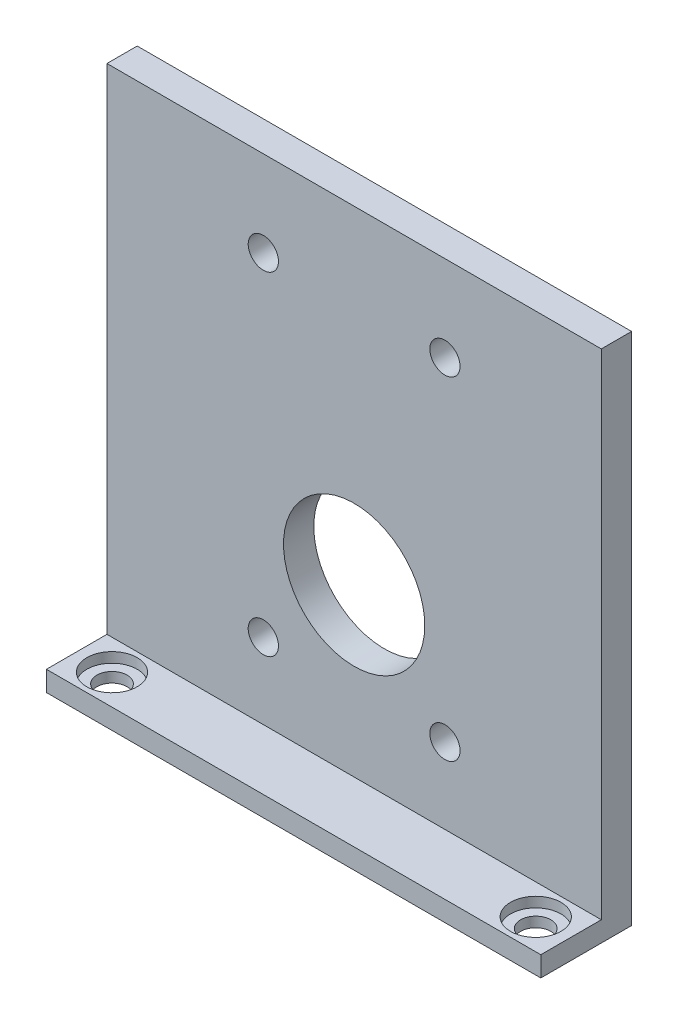
ISO-10303-21;
HEADER;
FILE_DESCRIPTION(('STEP AP214'),'2;1');
FILE_NAME('part.step','',(''),(''),'','','');
FILE_SCHEMA(('AUTOMOTIVE_DESIGN { 1 0 10303 214 1 1 1 1 }'));
ENDSEC;
DATA;
#1=APPLICATION_CONTEXT('core data for automotive mechanical design processes');
#2=APPLICATION_PROTOCOL_DEFINITION('international standard','automotive_design',2000,#1);
#3=PRODUCT_CONTEXT('',#1,'mechanical');
#4=PRODUCT('Part','Part','',(#3));
#5=PRODUCT_RELATED_PRODUCT_CATEGORY('part','',(#4));
#6=PRODUCT_DEFINITION_FORMATION('','',#4);
#7=PRODUCT_DEFINITION_CONTEXT('part definition',#1,'design');
#8=PRODUCT_DEFINITION('design','',#6,#7);
#9=PRODUCT_DEFINITION_SHAPE('','',#8);
#10=(LENGTH_UNIT() NAMED_UNIT(*) SI_UNIT(.MILLI.,.METRE.));
#11=(NAMED_UNIT(*) PLANE_ANGLE_UNIT() SI_UNIT($,.RADIAN.));
#12=(NAMED_UNIT(*) SI_UNIT($,.STERADIAN.) SOLID_ANGLE_UNIT());
#13=UNCERTAINTY_MEASURE_WITH_UNIT(LENGTH_MEASURE(1.E-05),#10,'distance_accuracy_value','');
#14=(GEOMETRIC_REPRESENTATION_CONTEXT(3) GLOBAL_UNCERTAINTY_ASSIGNED_CONTEXT((#13)) GLOBAL_UNIT_ASSIGNED_CONTEXT((#10,
#11,#12)) REPRESENTATION_CONTEXT('',''));
#15=CARTESIAN_POINT('',(0.,0.,0.));
#16=DIRECTION('',(0.,0.,1.));
#17=DIRECTION('',(1.,0.,0.));
#18=AXIS2_PLACEMENT_3D('',#15,#16,#17);
#19=CARTESIAN_POINT('',(24.5,2.,-4.5));
#20=DIRECTION('',(-1.,0.,0.));
#21=DIRECTION('',(0.,0.,1.));
#22=AXIS2_PLACEMENT_3D('',#19,#20,#21);
#23=PLANE('',#22);
#24=DIRECTION('',(0.,0.,-1.));
#25=VECTOR('',#24,1.);
#26=CARTESIAN_POINT('',(24.5,0.,-4.5));
#27=LINE('',#26,#25);
#28=CARTESIAN_POINT('',(24.5,0.,4.5));
#29=VERTEX_POINT('',#28);
#30=CARTESIAN_POINT('',(24.5,0.,-4.5));
#31=VERTEX_POINT('',#30);
#32=EDGE_CURVE('E90',#29,#31,#27,.T.);
#33=ORIENTED_EDGE('',*,*,#32,.T.);
#34=DIRECTION('',(0.,-1.,0.));
#35=VECTOR('',#34,1.);
#36=CARTESIAN_POINT('',(24.5,2.,-4.5));
#37=LINE('',#36,#35);
#38=CARTESIAN_POINT('',(24.5,51.,-4.5));
#39=VERTEX_POINT('',#38);
#40=EDGE_CURVE('E11',#39,#31,#37,.T.);
#41=ORIENTED_EDGE('',*,*,#40,.F.);
#42=DIRECTION('',(0.,0.,-1.));
#43=VECTOR('',#42,1.);
#44=CARTESIAN_POINT('',(24.5,51.,-4.5));
#45=LINE('',#44,#43);
#46=CARTESIAN_POINT('',(24.5,51.,-1.5));
#47=VERTEX_POINT('',#46);
#48=EDGE_CURVE('E164',#47,#39,#45,.T.);
#49=ORIENTED_EDGE('',*,*,#48,.F.);
#50=DIRECTION('',(0.,-1.,0.));
#51=VECTOR('',#50,1.);
#52=CARTESIAN_POINT('',(24.5,51.,-1.5));
#53=LINE('',#52,#51);
#54=CARTESIAN_POINT('',(24.5,2.,-1.5));
#55=VERTEX_POINT('',#54);
#56=EDGE_CURVE('E95',#47,#55,#53,.T.);
#57=ORIENTED_EDGE('',*,*,#56,.T.);
#58=DIRECTION('',(0.,0.,-1.));
#59=VECTOR('',#58,1.);
#60=CARTESIAN_POINT('',(24.5,2.,-4.5));
#61=LINE('',#60,#59);
#62=CARTESIAN_POINT('',(24.5,2.,4.5));
#63=VERTEX_POINT('',#62);
#64=EDGE_CURVE('E84',#63,#55,#61,.T.);
#65=ORIENTED_EDGE('',*,*,#64,.F.);
#66=DIRECTION('',(0.,-1.,0.));
#67=VECTOR('',#66,1.);
#68=CARTESIAN_POINT('',(24.5,2.,4.5));
#69=LINE('',#68,#67);
#70=EDGE_CURVE('E77',#63,#29,#69,.T.);
#71=ORIENTED_EDGE('',*,*,#70,.T.);
#72=EDGE_LOOP('',(#33,#41,#49,#57,#65,#71));
#73=FACE_BOUND('',#72,.T.);
#74=ADVANCED_FACE('F33',(#73),#23,.F.);
#75=CARTESIAN_POINT('',(-24.5,2.,-4.5));
#76=DIRECTION('',(0.,0.,1.));
#77=DIRECTION('',(1.,0.,0.));
#78=AXIS2_PLACEMENT_3D('',#75,#76,#77);
#79=PLANE('',#78);
#80=CARTESIAN_POINT('',(9.,9.5,-4.5));
#81=DIRECTION('',(0.,0.,1.));
#82=DIRECTION('',(1.,0.,0.));
#83=AXIS2_PLACEMENT_3D('',#80,#81,#82);
#84=CIRCLE('',#83,1.5);
#85=CARTESIAN_POINT('',(10.5,9.5,-4.5));
#86=VERTEX_POINT('',#85);
#87=EDGE_CURVE('E144',#86,#86,#84,.T.);
#88=ORIENTED_EDGE('',*,*,#87,.T.);
#89=EDGE_LOOP('',(#88));
#90=FACE_BOUND('',#89,.T.);
#91=CARTESIAN_POINT('',(-9.00000000000001,42.5,-4.5));
#92=DIRECTION('',(0.,0.,1.));
#93=DIRECTION('',(1.,0.,0.));
#94=AXIS2_PLACEMENT_3D('',#91,#92,#93);
#95=CIRCLE('',#94,1.5);
#96=CARTESIAN_POINT('',(-7.50000000000001,42.5,-4.5));
#97=VERTEX_POINT('',#96);
#98=EDGE_CURVE('E151',#97,#97,#95,.T.);
#99=ORIENTED_EDGE('',*,*,#98,.T.);
#100=EDGE_LOOP('',(#99));
#101=FACE_BOUND('',#100,.T.);
#102=CARTESIAN_POINT('',(8.99999999999999,42.5,-4.5));
#103=DIRECTION('',(0.,0.,1.));
#104=DIRECTION('',(1.,0.,0.));
#105=AXIS2_PLACEMENT_3D('',#102,#103,#104);
#106=CIRCLE('',#105,1.5);
#107=CARTESIAN_POINT('',(10.5,42.5,-4.5));
#108=VERTEX_POINT('',#107);
#109=EDGE_CURVE('E132',#108,#108,#106,.T.);
#110=ORIENTED_EDGE('',*,*,#109,.T.);
#111=EDGE_LOOP('',(#110));
#112=FACE_BOUND('',#111,.T.);
#113=CARTESIAN_POINT('',(0.,18.5,-4.5));
#114=DIRECTION('',(0.,0.,1.));
#115=DIRECTION('',(1.,0.,0.));
#116=AXIS2_PLACEMENT_3D('',#113,#114,#115);
#117=CIRCLE('',#116,7.);
#118=CARTESIAN_POINT('',(7.,18.5,-4.5));
#119=VERTEX_POINT('',#118);
#120=EDGE_CURVE('E139',#119,#119,#117,.T.);
#121=ORIENTED_EDGE('',*,*,#120,.T.);
#122=EDGE_LOOP('',(#121));
#123=FACE_BOUND('',#122,.T.);
#124=CARTESIAN_POINT('',(-9.,9.5,-4.5));
#125=DIRECTION('',(0.,0.,1.));
#126=DIRECTION('',(1.,0.,0.));
#127=AXIS2_PLACEMENT_3D('',#124,#125,#126);
#128=CIRCLE('',#127,1.5);
#129=CARTESIAN_POINT('',(-7.5,9.5,-4.5));
#130=VERTEX_POINT('',#129);
#131=EDGE_CURVE('E156',#130,#130,#128,.T.);
#132=ORIENTED_EDGE('',*,*,#131,.T.);
#133=EDGE_LOOP('',(#132));
#134=FACE_BOUND('',#133,.T.);
#135=DIRECTION('',(-1.,0.,0.));
#136=VECTOR('',#135,1.);
#137=CARTESIAN_POINT('',(-24.5,0.,-4.5));
#138=LINE('',#137,#136);
#139=CARTESIAN_POINT('',(-24.5,0.,-4.5));
#140=VERTEX_POINT('',#139);
#141=EDGE_CURVE('E94',#31,#140,#138,.T.);
#142=ORIENTED_EDGE('',*,*,#141,.T.);
#143=DIRECTION('',(0.,-1.,0.));
#144=VECTOR('',#143,1.);
#145=CARTESIAN_POINT('',(-24.5,2.,-4.5));
#146=LINE('',#145,#144);
#147=CARTESIAN_POINT('',(-24.5,51.,-4.5));
#148=VERTEX_POINT('',#147);
#149=EDGE_CURVE('E41',#148,#140,#146,.T.);
#150=ORIENTED_EDGE('',*,*,#149,.F.);
#151=DIRECTION('',(-1.,0.,0.));
#152=VECTOR('',#151,1.);
#153=CARTESIAN_POINT('',(-24.5,51.,-4.5));
#154=LINE('',#153,#152);
#155=EDGE_CURVE('E167',#39,#148,#154,.T.);
#156=ORIENTED_EDGE('',*,*,#155,.F.);
#157=ORIENTED_EDGE('',*,*,#40,.T.);
#158=EDGE_LOOP('',(#142,#150,#156,#157));
#159=FACE_BOUND('',#158,.T.);
#160=ADVANCED_FACE('F186',(#90,#101,#112,#123,#134,#159),#79,.F.);
#161=CARTESIAN_POINT('',(-24.5,2.,-4.5));
#162=DIRECTION('',(1.,0.,0.));
#163=DIRECTION('',(0.,0.,-1.));
#164=AXIS2_PLACEMENT_3D('',#161,#162,#163);
#165=PLANE('',#164);
#166=DIRECTION('',(0.,0.,1.));
#167=VECTOR('',#166,1.);
#168=CARTESIAN_POINT('',(-24.5,0.,-4.5));
#169=LINE('',#168,#167);
#170=CARTESIAN_POINT('',(-24.5,0.,4.5));
#171=VERTEX_POINT('',#170);
#172=EDGE_CURVE('E85',#140,#171,#169,.T.);
#173=ORIENTED_EDGE('',*,*,#172,.T.);
#174=DIRECTION('',(0.,-1.,0.));
#175=VECTOR('',#174,1.);
#176=CARTESIAN_POINT('',(-24.5,2.,4.5));
#177=LINE('',#176,#175);
#178=CARTESIAN_POINT('',(-24.5,2.,4.5));
#179=VERTEX_POINT('',#178);
#180=EDGE_CURVE('E80',#179,#171,#177,.T.);
#181=ORIENTED_EDGE('',*,*,#180,.F.);
#182=DIRECTION('',(0.,0.,1.));
#183=VECTOR('',#182,1.);
#184=CARTESIAN_POINT('',(-24.5,2.,-4.5));
#185=LINE('',#184,#183);
#186=CARTESIAN_POINT('',(-24.5,2.,-1.5));
#187=VERTEX_POINT('',#186);
#188=EDGE_CURVE('E176',#187,#179,#185,.T.);
#189=ORIENTED_EDGE('',*,*,#188,.F.);
#190=DIRECTION('',(0.,-1.,0.));
#191=VECTOR('',#190,1.);
#192=CARTESIAN_POINT('',(-24.5,51.,-1.5));
#193=LINE('',#192,#191);
#194=CARTESIAN_POINT('',(-24.5,51.,-1.5));
#195=VERTEX_POINT('',#194);
#196=EDGE_CURVE('E98',#195,#187,#193,.T.);
#197=ORIENTED_EDGE('',*,*,#196,.F.);
#198=DIRECTION('',(0.,0.,1.));
#199=VECTOR('',#198,1.);
#200=CARTESIAN_POINT('',(-24.5,51.,-4.5));
#201=LINE('',#200,#199);
#202=EDGE_CURVE('E170',#148,#195,#201,.T.);
#203=ORIENTED_EDGE('',*,*,#202,.F.);
#204=ORIENTED_EDGE('',*,*,#149,.T.);
#205=EDGE_LOOP('',(#173,#181,#189,#197,#203,#204));
#206=FACE_BOUND('',#205,.T.);
#207=ADVANCED_FACE('F180',(#206),#165,.F.);
#208=CARTESIAN_POINT('',(-24.5,2.,4.5));
#209=DIRECTION('',(0.,0.,-1.));
#210=DIRECTION('',(-1.,0.,0.));
#211=AXIS2_PLACEMENT_3D('',#208,#209,#210);
#212=PLANE('',#211);
#213=DIRECTION('',(1.,0.,0.));
#214=VECTOR('',#213,1.);
#215=CARTESIAN_POINT('',(-24.5,0.,4.5));
#216=LINE('',#215,#214);
#217=EDGE_CURVE('E74',#171,#29,#216,.T.);
#218=ORIENTED_EDGE('',*,*,#217,.T.);
#219=ORIENTED_EDGE('',*,*,#70,.F.);
#220=DIRECTION('',(1.,0.,0.));
#221=VECTOR('',#220,1.);
#222=CARTESIAN_POINT('',(-24.5,2.,4.5));
#223=LINE('',#222,#221);
#224=EDGE_CURVE('E55',#179,#63,#223,.T.);
#225=ORIENTED_EDGE('',*,*,#224,.F.);
#226=ORIENTED_EDGE('',*,*,#180,.T.);
#227=EDGE_LOOP('',(#218,#219,#225,#226));
#228=FACE_BOUND('',#227,.T.);
#229=ADVANCED_FACE('F76',(#228),#212,.F.);
#230=CARTESIAN_POINT('',(0.,2.,0.));
#231=DIRECTION('',(0.,1.,0.));
#232=DIRECTION('',(0.,0.,1.));
#233=AXIS2_PLACEMENT_3D('',#230,#231,#232);
#234=PLANE('',#233);
#235=CARTESIAN_POINT('',(-21.,2.,1.50000000000001));
#236=DIRECTION('',(0.,1.,0.));
#237=DIRECTION('',(0.,0.,1.));
#238=AXIS2_PLACEMENT_3D('',#235,#236,#237);
#239=CIRCLE('',#238,2.5);
#240=CARTESIAN_POINT('',(-21.,2.,4.00000000000001));
#241=VERTEX_POINT('',#240);
#242=EDGE_CURVE('E127',#241,#241,#239,.T.);
#243=ORIENTED_EDGE('',*,*,#242,.F.);
#244=EDGE_LOOP('',(#243));
#245=FACE_BOUND('',#244,.T.);
#246=CARTESIAN_POINT('',(21.,2.,1.50000000000001));
#247=DIRECTION('',(0.,1.,0.));
#248=DIRECTION('',(0.,0.,1.));
#249=AXIS2_PLACEMENT_3D('',#246,#247,#248);
#250=CIRCLE('',#249,2.5);
#251=CARTESIAN_POINT('',(21.,2.,4.00000000000001));
#252=VERTEX_POINT('',#251);
#253=EDGE_CURVE('E108',#252,#252,#250,.T.);
#254=ORIENTED_EDGE('',*,*,#253,.F.);
#255=EDGE_LOOP('',(#254));
#256=FACE_BOUND('',#255,.T.);
#257=DIRECTION('',(1.,0.,0.));
#258=VECTOR('',#257,1.);
#259=CARTESIAN_POINT('',(-24.5,2.,-1.5));
#260=LINE('',#259,#258);
#261=EDGE_CURVE('E49',#187,#55,#260,.T.);
#262=ORIENTED_EDGE('',*,*,#261,.F.);
#263=ORIENTED_EDGE('',*,*,#188,.T.);
#264=ORIENTED_EDGE('',*,*,#224,.T.);
#265=ORIENTED_EDGE('',*,*,#64,.T.);
#266=EDGE_LOOP('',(#262,#263,#264,#265));
#267=FACE_BOUND('',#266,.T.);
#268=ADVANCED_FACE('F177',(#245,#256,#267),#234,.T.);
#269=CARTESIAN_POINT('',(0.,0.,0.));
#270=DIRECTION('',(0.,1.,0.));
#271=DIRECTION('',(0.,0.,1.));
#272=AXIS2_PLACEMENT_3D('',#269,#270,#271);
#273=PLANE('',#272);
#274=CARTESIAN_POINT('',(21.,0.,1.50000000000001));
#275=DIRECTION('',(0.,1.,0.));
#276=DIRECTION('',(0.,0.,1.));
#277=AXIS2_PLACEMENT_3D('',#274,#275,#276);
#278=CIRCLE('',#277,1.5);
#279=CARTESIAN_POINT('',(21.,0.,3.00000000000001));
#280=VERTEX_POINT('',#279);
#281=EDGE_CURVE('E36',#280,#280,#278,.T.);
#282=ORIENTED_EDGE('',*,*,#281,.T.);
#283=EDGE_LOOP('',(#282));
#284=FACE_BOUND('',#283,.T.);
#285=CARTESIAN_POINT('',(-21.,0.,1.50000000000001));
#286=DIRECTION('',(0.,1.,0.));
#287=DIRECTION('',(0.,0.,1.));
#288=AXIS2_PLACEMENT_3D('',#285,#286,#287);
#289=CIRCLE('',#288,1.5);
#290=CARTESIAN_POINT('',(-21.,0.,3.00000000000001));
#291=VERTEX_POINT('',#290);
#292=EDGE_CURVE('E106',#291,#291,#289,.T.);
#293=ORIENTED_EDGE('',*,*,#292,.T.);
#294=EDGE_LOOP('',(#293));
#295=FACE_BOUND('',#294,.T.);
#296=ORIENTED_EDGE('',*,*,#32,.F.);
#297=ORIENTED_EDGE('',*,*,#217,.F.);
#298=ORIENTED_EDGE('',*,*,#172,.F.);
#299=ORIENTED_EDGE('',*,*,#141,.F.);
#300=EDGE_LOOP('',(#296,#297,#298,#299));
#301=FACE_BOUND('',#300,.T.);
#302=ADVANCED_FACE('F93',(#284,#295,#301),#273,.F.);
#303=CARTESIAN_POINT('',(-24.5,51.,-1.5));
#304=DIRECTION('',(0.,0.,-1.));
#305=DIRECTION('',(-1.,0.,0.));
#306=AXIS2_PLACEMENT_3D('',#303,#304,#305);
#307=PLANE('',#306);
#308=CARTESIAN_POINT('',(9.,9.5,-1.5));
#309=DIRECTION('',(0.,0.,1.));
#310=DIRECTION('',(1.,0.,0.));
#311=AXIS2_PLACEMENT_3D('',#308,#309,#310);
#312=CIRCLE('',#311,1.5);
#313=CARTESIAN_POINT('',(10.5,9.5,-1.5));
#314=VERTEX_POINT('',#313);
#315=EDGE_CURVE('E148',#314,#314,#312,.T.);
#316=ORIENTED_EDGE('',*,*,#315,.F.);
#317=EDGE_LOOP('',(#316));
#318=FACE_BOUND('',#317,.T.);
#319=CARTESIAN_POINT('',(-9.00000000000001,42.5,-1.5));
#320=DIRECTION('',(0.,0.,1.));
#321=DIRECTION('',(1.,0.,0.));
#322=AXIS2_PLACEMENT_3D('',#319,#320,#321);
#323=CIRCLE('',#322,1.5);
#324=CARTESIAN_POINT('',(-7.50000000000001,42.5,-1.5));
#325=VERTEX_POINT('',#324);
#326=EDGE_CURVE('E135',#325,#325,#323,.T.);
#327=ORIENTED_EDGE('',*,*,#326,.F.);
#328=EDGE_LOOP('',(#327));
#329=FACE_BOUND('',#328,.T.);
#330=CARTESIAN_POINT('',(8.99999999999999,42.5,-1.5));
#331=DIRECTION('',(0.,0.,1.));
#332=DIRECTION('',(1.,0.,0.));
#333=AXIS2_PLACEMENT_3D('',#330,#331,#332);
#334=CIRCLE('',#333,1.5);
#335=CARTESIAN_POINT('',(10.5,42.5,-1.5));
#336=VERTEX_POINT('',#335);
#337=EDGE_CURVE('E136',#336,#336,#334,.T.);
#338=ORIENTED_EDGE('',*,*,#337,.F.);
#339=EDGE_LOOP('',(#338));
#340=FACE_BOUND('',#339,.T.);
#341=CARTESIAN_POINT('',(0.,18.5,-1.5));
#342=DIRECTION('',(0.,0.,1.));
#343=DIRECTION('',(1.,0.,0.));
#344=AXIS2_PLACEMENT_3D('',#341,#342,#343);
#345=CIRCLE('',#344,7.);
#346=CARTESIAN_POINT('',(7.,18.5,-1.5));
#347=VERTEX_POINT('',#346);
#348=EDGE_CURVE('E126',#347,#347,#345,.T.);
#349=ORIENTED_EDGE('',*,*,#348,.F.);
#350=EDGE_LOOP('',(#349));
#351=FACE_BOUND('',#350,.T.);
#352=CARTESIAN_POINT('',(-9.,9.5,-1.5));
#353=DIRECTION('',(0.,0.,1.));
#354=DIRECTION('',(1.,0.,0.));
#355=AXIS2_PLACEMENT_3D('',#352,#353,#354);
#356=CIRCLE('',#355,1.5);
#357=CARTESIAN_POINT('',(-7.5,9.5,-1.5));
#358=VERTEX_POINT('',#357);
#359=EDGE_CURVE('E147',#358,#358,#356,.T.);
#360=ORIENTED_EDGE('',*,*,#359,.F.);
#361=EDGE_LOOP('',(#360));
#362=FACE_BOUND('',#361,.T.);
#363=ORIENTED_EDGE('',*,*,#261,.T.);
#364=ORIENTED_EDGE('',*,*,#56,.F.);
#365=DIRECTION('',(1.,0.,0.));
#366=VECTOR('',#365,1.);
#367=CARTESIAN_POINT('',(-24.5,51.,-1.5));
#368=LINE('',#367,#366);
#369=EDGE_CURVE('E161',#195,#47,#368,.T.);
#370=ORIENTED_EDGE('',*,*,#369,.F.);
#371=ORIENTED_EDGE('',*,*,#196,.T.);
#372=EDGE_LOOP('',(#363,#364,#370,#371));
#373=FACE_BOUND('',#372,.T.);
#374=ADVANCED_FACE('F200',(#318,#329,#340,#351,#362,#373),#307,.F.);
#375=CARTESIAN_POINT('',(0.,51.,0.));
#376=DIRECTION('',(0.,-1.,0.));
#377=DIRECTION('',(0.,0.,-1.));
#378=AXIS2_PLACEMENT_3D('',#375,#376,#377);
#379=PLANE('',#378);
#380=ORIENTED_EDGE('',*,*,#369,.T.);
#381=ORIENTED_EDGE('',*,*,#48,.T.);
#382=ORIENTED_EDGE('',*,*,#155,.T.);
#383=ORIENTED_EDGE('',*,*,#202,.T.);
#384=EDGE_LOOP('',(#380,#381,#382,#383));
#385=FACE_BOUND('',#384,.T.);
#386=ADVANCED_FACE('F190',(#385),#379,.F.);
#387=CARTESIAN_POINT('',(-9.,9.5,-4.5));
#388=DIRECTION('',(0.,0.,1.));
#389=DIRECTION('',(1.,0.,0.));
#390=AXIS2_PLACEMENT_3D('',#387,#388,#389);
#391=CYLINDRICAL_SURFACE('',#390,1.5);
#392=ORIENTED_EDGE('',*,*,#131,.F.);
#393=EDGE_LOOP('',(#392));
#394=FACE_BOUND('',#393,.T.);
#395=ORIENTED_EDGE('',*,*,#359,.T.);
#396=EDGE_LOOP('',(#395));
#397=FACE_BOUND('',#396,.T.);
#398=ADVANCED_FACE('F208',(#394,#397),#391,.F.);
#399=CARTESIAN_POINT('',(0.,18.5,-4.5));
#400=DIRECTION('',(0.,0.,1.));
#401=DIRECTION('',(1.,0.,0.));
#402=AXIS2_PLACEMENT_3D('',#399,#400,#401);
#403=CYLINDRICAL_SURFACE('',#402,7.);
#404=ORIENTED_EDGE('',*,*,#120,.F.);
#405=EDGE_LOOP('',(#404));
#406=FACE_BOUND('',#405,.T.);
#407=ORIENTED_EDGE('',*,*,#348,.T.);
#408=EDGE_LOOP('',(#407));
#409=FACE_BOUND('',#408,.T.);
#410=ADVANCED_FACE('F257',(#406,#409),#403,.F.);
#411=CARTESIAN_POINT('',(8.99999999999999,42.5,-4.5));
#412=DIRECTION('',(0.,0.,1.));
#413=DIRECTION('',(1.,0.,0.));
#414=AXIS2_PLACEMENT_3D('',#411,#412,#413);
#415=CYLINDRICAL_SURFACE('',#414,1.5);
#416=ORIENTED_EDGE('',*,*,#109,.F.);
#417=EDGE_LOOP('',(#416));
#418=FACE_BOUND('',#417,.T.);
#419=ORIENTED_EDGE('',*,*,#337,.T.);
#420=EDGE_LOOP('',(#419));
#421=FACE_BOUND('',#420,.T.);
#422=ADVANCED_FACE('F254',(#418,#421),#415,.F.);
#423=CARTESIAN_POINT('',(-9.00000000000001,42.5,-4.5));
#424=DIRECTION('',(0.,0.,1.));
#425=DIRECTION('',(1.,0.,0.));
#426=AXIS2_PLACEMENT_3D('',#423,#424,#425);
#427=CYLINDRICAL_SURFACE('',#426,1.5);
#428=ORIENTED_EDGE('',*,*,#98,.F.);
#429=EDGE_LOOP('',(#428));
#430=FACE_BOUND('',#429,.T.);
#431=ORIENTED_EDGE('',*,*,#326,.T.);
#432=EDGE_LOOP('',(#431));
#433=FACE_BOUND('',#432,.T.);
#434=ADVANCED_FACE('F248',(#430,#433),#427,.F.);
#435=CARTESIAN_POINT('',(9.,9.5,-4.5));
#436=DIRECTION('',(0.,0.,1.));
#437=DIRECTION('',(1.,0.,0.));
#438=AXIS2_PLACEMENT_3D('',#435,#436,#437);
#439=CYLINDRICAL_SURFACE('',#438,1.5);
#440=ORIENTED_EDGE('',*,*,#87,.F.);
#441=EDGE_LOOP('',(#440));
#442=FACE_BOUND('',#441,.T.);
#443=ORIENTED_EDGE('',*,*,#315,.T.);
#444=EDGE_LOOP('',(#443));
#445=FACE_BOUND('',#444,.T.);
#446=ADVANCED_FACE('F238',(#442,#445),#439,.F.);
#447=CARTESIAN_POINT('',(21.,1.,1.50000000000001));
#448=DIRECTION('',(0.,1.,0.));
#449=DIRECTION('',(0.,0.,1.));
#450=AXIS2_PLACEMENT_3D('',#447,#448,#449);
#451=CYLINDRICAL_SURFACE('',#450,2.5);
#452=CARTESIAN_POINT('',(21.,1.,1.50000000000001));
#453=DIRECTION('',(0.,1.,0.));
#454=DIRECTION('',(0.,0.,1.));
#455=AXIS2_PLACEMENT_3D('',#452,#453,#454);
#456=CIRCLE('',#455,2.5);
#457=CARTESIAN_POINT('',(21.,1.,4.00000000000001));
#458=VERTEX_POINT('',#457);
#459=EDGE_CURVE('E113',#458,#458,#456,.T.);
#460=ORIENTED_EDGE('',*,*,#459,.F.);
#461=EDGE_LOOP('',(#460));
#462=FACE_BOUND('',#461,.T.);
#463=ORIENTED_EDGE('',*,*,#253,.T.);
#464=EDGE_LOOP('',(#463));
#465=FACE_BOUND('',#464,.T.);
#466=ADVANCED_FACE('F235',(#462,#465),#451,.F.);
#467=CARTESIAN_POINT('',(21.,1.,1.50000000000001));
#468=DIRECTION('',(0.,1.,0.));
#469=DIRECTION('',(0.,0.,1.));
#470=AXIS2_PLACEMENT_3D('',#467,#468,#469);
#471=PLANE('',#470);
#472=CARTESIAN_POINT('',(21.,1.,1.50000000000001));
#473=DIRECTION('',(0.,1.,0.));
#474=DIRECTION('',(0.,0.,1.));
#475=AXIS2_PLACEMENT_3D('',#472,#473,#474);
#476=CIRCLE('',#475,1.5);
#477=CARTESIAN_POINT('',(21.,1.,3.00000000000001));
#478=VERTEX_POINT('',#477);
#479=EDGE_CURVE('E120',#478,#478,#476,.T.);
#480=ORIENTED_EDGE('',*,*,#479,.F.);
#481=EDGE_LOOP('',(#480));
#482=FACE_BOUND('',#481,.T.);
#483=ORIENTED_EDGE('',*,*,#459,.T.);
#484=EDGE_LOOP('',(#483));
#485=FACE_BOUND('',#484,.T.);
#486=ADVANCED_FACE('F237',(#482,#485),#471,.T.);
#487=CARTESIAN_POINT('',(-21.,1.,1.50000000000001));
#488=DIRECTION('',(0.,1.,0.));
#489=DIRECTION('',(0.,0.,1.));
#490=AXIS2_PLACEMENT_3D('',#487,#488,#489);
#491=CYLINDRICAL_SURFACE('',#490,2.5);
#492=CARTESIAN_POINT('',(-21.,1.,1.50000000000001));
#493=DIRECTION('',(0.,1.,0.));
#494=DIRECTION('',(0.,0.,1.));
#495=AXIS2_PLACEMENT_3D('',#492,#493,#494);
#496=CIRCLE('',#495,2.5);
#497=CARTESIAN_POINT('',(-21.,1.,4.00000000000001));
#498=VERTEX_POINT('',#497);
#499=EDGE_CURVE('E123',#498,#498,#496,.T.);
#500=ORIENTED_EDGE('',*,*,#499,.F.);
#501=EDGE_LOOP('',(#500));
#502=FACE_BOUND('',#501,.T.);
#503=ORIENTED_EDGE('',*,*,#242,.T.);
#504=EDGE_LOOP('',(#503));
#505=FACE_BOUND('',#504,.T.);
#506=ADVANCED_FACE('F245',(#502,#505),#491,.F.);
#507=CARTESIAN_POINT('',(-21.,1.,1.50000000000001));
#508=DIRECTION('',(0.,1.,0.));
#509=DIRECTION('',(0.,0.,1.));
#510=AXIS2_PLACEMENT_3D('',#507,#508,#509);
#511=PLANE('',#510);
#512=CARTESIAN_POINT('',(-21.,1.,1.50000000000001));
#513=DIRECTION('',(0.,1.,0.));
#514=DIRECTION('',(0.,0.,1.));
#515=AXIS2_PLACEMENT_3D('',#512,#513,#514);
#516=CIRCLE('',#515,1.5);
#517=CARTESIAN_POINT('',(-21.,1.,3.00000000000001));
#518=VERTEX_POINT('',#517);
#519=EDGE_CURVE('E109',#518,#518,#516,.T.);
#520=ORIENTED_EDGE('',*,*,#519,.F.);
#521=EDGE_LOOP('',(#520));
#522=FACE_BOUND('',#521,.T.);
#523=ORIENTED_EDGE('',*,*,#499,.T.);
#524=EDGE_LOOP('',(#523));
#525=FACE_BOUND('',#524,.T.);
#526=ADVANCED_FACE('F312',(#522,#525),#511,.T.);
#527=CARTESIAN_POINT('',(-21.,-1.,1.50000000000001));
#528=DIRECTION('',(0.,1.,0.));
#529=DIRECTION('',(0.,0.,1.));
#530=AXIS2_PLACEMENT_3D('',#527,#528,#529);
#531=CYLINDRICAL_SURFACE('',#530,1.5);
#532=ORIENTED_EDGE('',*,*,#519,.T.);
#533=EDGE_LOOP('',(#532));
#534=FACE_BOUND('',#533,.T.);
#535=ORIENTED_EDGE('',*,*,#292,.F.);
#536=EDGE_LOOP('',(#535));
#537=FACE_BOUND('',#536,.T.);
#538=ADVANCED_FACE('F321',(#534,#537),#531,.F.);
#539=CARTESIAN_POINT('',(21.,-1.,1.50000000000001));
#540=DIRECTION('',(0.,1.,0.));
#541=DIRECTION('',(0.,0.,1.));
#542=AXIS2_PLACEMENT_3D('',#539,#540,#541);
#543=CYLINDRICAL_SURFACE('',#542,1.5);
#544=ORIENTED_EDGE('',*,*,#479,.T.);
#545=EDGE_LOOP('',(#544));
#546=FACE_BOUND('',#545,.T.);
#547=ORIENTED_EDGE('',*,*,#281,.F.);
#548=EDGE_LOOP('',(#547));
#549=FACE_BOUND('',#548,.T.);
#550=ADVANCED_FACE('F331',(#546,#549),#543,.F.);
#551=CLOSED_SHELL('',(#74,#160,#207,#229,#268,#302,#374,#386,#398,#410,#422,#434,#446,#466,#486,
#506,#526,#538,#550));
#552=MANIFOLD_SOLID_BREP('B2',#551);
#553=ADVANCED_BREP_SHAPE_REPRESENTATION('',(#18,#552),#14);
#554=SHAPE_DEFINITION_REPRESENTATION(#9,#553);
ENDSEC;
END-ISO-10303-21;
